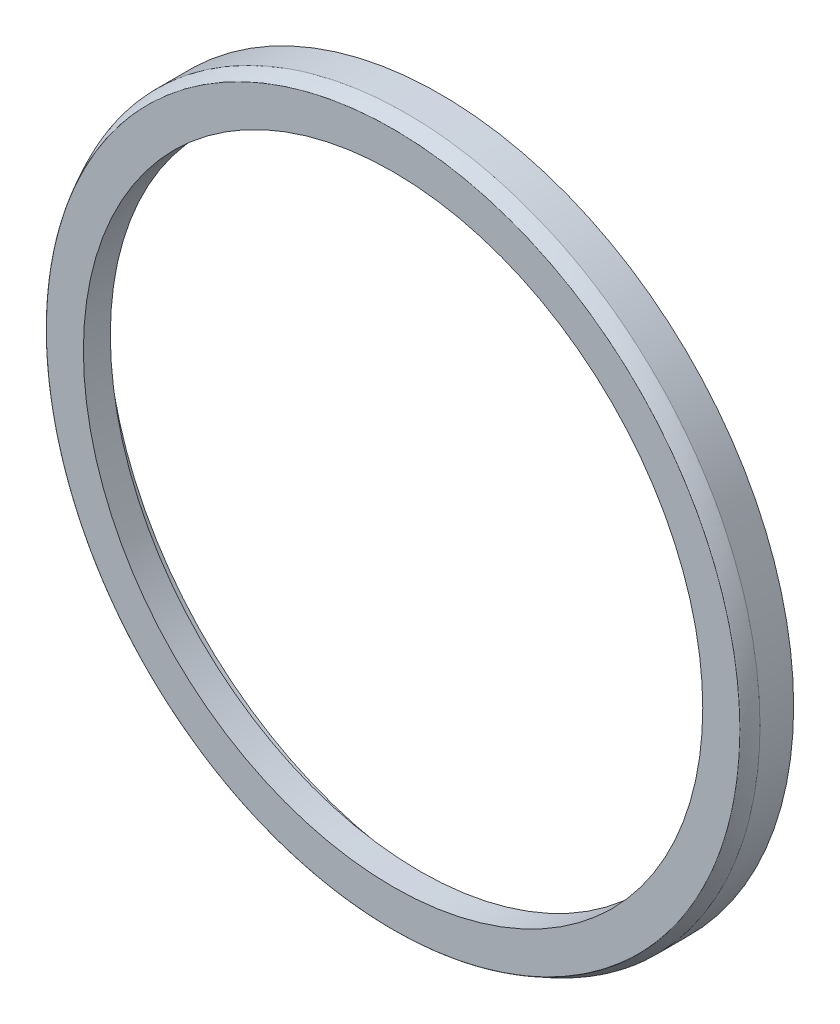
ISO-10303-21;
HEADER;
FILE_DESCRIPTION(('STEP AP214'),'2;1');
FILE_NAME('part.step','',(''),(''),'','','');
FILE_SCHEMA(('AUTOMOTIVE_DESIGN { 1 0 10303 214 1 1 1 1 }'));
ENDSEC;
DATA;
#1=APPLICATION_CONTEXT('core data for automotive mechanical design processes');
#2=APPLICATION_PROTOCOL_DEFINITION('international standard','automotive_design',2000,#1);
#3=PRODUCT_CONTEXT('',#1,'mechanical');
#4=PRODUCT('Part','Part','',(#3));
#5=PRODUCT_RELATED_PRODUCT_CATEGORY('part','',(#4));
#6=PRODUCT_DEFINITION_FORMATION('','',#4);
#7=PRODUCT_DEFINITION_CONTEXT('part definition',#1,'design');
#8=PRODUCT_DEFINITION('design','',#6,#7);
#9=PRODUCT_DEFINITION_SHAPE('','',#8);
#10=(LENGTH_UNIT() NAMED_UNIT(*) SI_UNIT(.MILLI.,.METRE.));
#11=(NAMED_UNIT(*) PLANE_ANGLE_UNIT() SI_UNIT($,.RADIAN.));
#12=(NAMED_UNIT(*) SI_UNIT($,.STERADIAN.) SOLID_ANGLE_UNIT());
#13=UNCERTAINTY_MEASURE_WITH_UNIT(LENGTH_MEASURE(1.E-05),#10,'distance_accuracy_value','');
#14=(GEOMETRIC_REPRESENTATION_CONTEXT(3) GLOBAL_UNCERTAINTY_ASSIGNED_CONTEXT((#13)) GLOBAL_UNIT_ASSIGNED_CONTEXT((#10,
#11,#12)) REPRESENTATION_CONTEXT('',''));
#15=CARTESIAN_POINT('',(0.,0.,0.));
#16=DIRECTION('',(0.,0.,1.));
#17=DIRECTION('',(1.,0.,0.));
#18=AXIS2_PLACEMENT_3D('',#15,#16,#17);
#19=CARTESIAN_POINT('',(0.,0.,4.));
#20=DIRECTION('',(0.,0.,-1.));
#21=DIRECTION('',(-1.,0.,0.));
#22=AXIS2_PLACEMENT_3D('',#19,#20,#21);
#23=CYLINDRICAL_SURFACE('',#22,52.5);
#24=CARTESIAN_POINT('',(52.5,0.,2.));
#25=CARTESIAN_POINT('',(52.5,3.4361169646343,2.));
#26=CARTESIAN_POINT('',(52.1615803862874,6.87214896517834,2.));
#27=CARTESIAN_POINT('',(50.8208740560518,13.6123348465151,2.));
#28=CARTESIAN_POINT('',(49.8186204908821,16.9163220642137,2.));
#29=CARTESIAN_POINT('',(47.188730422803,23.2654383341207,2.));
#30=CARTESIAN_POINT('',(45.5611589486117,26.3104103931131,2.));
#31=CARTESIAN_POINT('',(41.7431503431556,32.0244640739452,2.));
#32=CARTESIAN_POINT('',(39.5528076189387,34.6934044056488,2.));
#33=CARTESIAN_POINT('',(34.6934044056488,39.5528076189387,2.));
#34=CARTESIAN_POINT('',(32.0244640739492,41.7431503431529,2.));
#35=CARTESIAN_POINT('',(26.310410393109,45.5611589486144,2.));
#36=CARTESIAN_POINT('',(23.2654383341166,47.1887304228047,2.));
#37=CARTESIAN_POINT('',(16.9163220642178,49.8186204908804,2.));
#38=CARTESIAN_POINT('',(13.6123348465117,50.8208740560524,2.));
#39=CARTESIAN_POINT('',(6.87214896518182,52.1615803862867,2.));
#40=CARTESIAN_POINT('',(3.43611696464792,52.5,2.));
#41=CARTESIAN_POINT('',(-3.43611696464791,52.5,2.));
#42=CARTESIAN_POINT('',(-6.87214896517669,52.1615803862877,2.));
#43=CARTESIAN_POINT('',(-13.6123348465167,50.8208740560515,2.));
#44=CARTESIAN_POINT('',(-16.9163220642178,49.8186204908804,2.));
#45=CARTESIAN_POINT('',(-23.2654383341166,47.1887304228047,2.));
#46=CARTESIAN_POINT('',(-26.310410393105,45.5611589486171,2.));
#47=CARTESIAN_POINT('',(-32.0244640739532,41.7431503431502,2.));
#48=CARTESIAN_POINT('',(-34.6934044056488,39.5528076189387,2.));
#49=CARTESIAN_POINT('',(-39.5528076189388,34.6934044056487,2.));
#50=CARTESIAN_POINT('',(-41.7431503431492,32.0244640739546,2.));
#51=CARTESIAN_POINT('',(-45.561158948618,26.3104103931037,2.));
#52=CARTESIAN_POINT('',(-47.1887304228046,23.2654383341167,2.));
#53=CARTESIAN_POINT('',(-49.8186204908804,16.9163220642179,2.));
#54=CARTESIAN_POINT('',(-50.8208740560519,13.6123348465145,2.));
#55=CARTESIAN_POINT('',(-52.1615803862873,6.872148965179,2.));
#56=CARTESIAN_POINT('',(-52.5,3.43611696464792,2.));
#57=CARTESIAN_POINT('',(-52.5,-3.43611696464791,2.));
#58=CARTESIAN_POINT('',(-52.1615803862872,-6.8721489651795,2.));
#59=CARTESIAN_POINT('',(-50.820874056052,-13.6123348465139,2.));
#60=CARTESIAN_POINT('',(-49.8186204908825,-16.9163220642127,2.));
#61=CARTESIAN_POINT('',(-47.1887304228026,-23.2654383341215,2.));
#62=CARTESIAN_POINT('',(-45.5611589486207,-26.3104103930996,2.));
#63=CARTESIAN_POINT('',(-41.7431503431466,-32.0244640739586,2.));
#64=CARTESIAN_POINT('',(-39.5528076189387,-34.6934044056488,2.));
#65=CARTESIAN_POINT('',(-34.6934044056487,-39.5528076189388,2.));
#66=CARTESIAN_POINT('',(-32.0244640739579,-41.743150343147,2.));
#67=CARTESIAN_POINT('',(-26.3104103931004,-45.5611589486202,2.));
#68=CARTESIAN_POINT('',(-23.265438334117,-47.1887304228045,2.));
#69=CARTESIAN_POINT('',(-16.9163220642176,-49.8186204908805,2.));
#70=CARTESIAN_POINT('',(-13.6123348465185,-50.8208740560511,2.));
#71=CARTESIAN_POINT('',(-6.87214896517507,-52.1615803862881,2.));
#72=CARTESIAN_POINT('',(-3.43611696464783,-52.5,2.));
#73=CARTESIAN_POINT('',(3.436116964648,-52.5,2.));
#74=CARTESIAN_POINT('',(6.87214896517496,-52.1615803862881,2.));
#75=CARTESIAN_POINT('',(13.6123348465184,-50.8208740560511,2.));
#76=CARTESIAN_POINT('',(16.9163220642133,-49.8186204908823,2.));
#77=CARTESIAN_POINT('',(23.265438334121,-47.1887304228029,2.));
#78=CARTESIAN_POINT('',(26.3104103930963,-45.5611589486229,2.));
#79=CARTESIAN_POINT('',(32.0244640739619,-41.7431503431443,2.));
#80=CARTESIAN_POINT('',(34.6934044056399,-39.5528076189476,2.));
#81=CARTESIAN_POINT('',(39.5528076189474,-34.6934044056401,2.));
#82=CARTESIAN_POINT('',(41.7431503431524,-32.0244640739499,2.));
#83=CARTESIAN_POINT('',(45.5611589486148,-26.3104103931085,2.));
#84=CARTESIAN_POINT('',(47.1887304228007,-23.2654383341261,2.));
#85=CARTESIAN_POINT('',(49.8186204908843,-16.9163220642084,2.));
#86=CARTESIAN_POINT('',(50.8208740560517,-13.6123348465157,2.));
#87=CARTESIAN_POINT('',(52.1615803862875,-6.87214896517789,2.));
#88=CARTESIAN_POINT('',(52.5,-3.4361169646343,2.));
#89=CARTESIAN_POINT('',(52.5,0.,2.));
#90=(BOUNDED_CURVE() B_SPLINE_CURVE(3,(#24,#25,#26,#27,#28,#29,#30,#31,#32,#33,#34,#35,#36,#37,
#38,#39,#40,#41,#42,#43,#44,#45,#46,#47,#48,#49,#50,#51,#52,#53,#54,#55,#56,#57,#58,#59,#60,#61,
#62,#63,#64,#65,#66,#67,#68,#69,#70,#71,#72,#73,#74,#75,#76,#77,#78,#79,#80,#81,#82,#83,#84,#85,
#86,#87,#88,#89),.UNSPECIFIED.,.T.,.F.) B_SPLINE_CURVE_WITH_KNOTS((4,2,2,2,2,2,2,2,2,2,2,2,2,2,
2,2,2,2,2,2,2,2,2,2,2,2,2,2,2,2,2,2,4),(0.,0.196349540849362,0.392699081698724,
0.589048622548086,0.785398163397448,0.98174770424681,1.17809724509617,1.37444678594553,
1.5707963267949,1.76714586764426,1.96349540849362,2.15984494934298,2.35619449019234,
2.55254403104171,2.74889357189107,2.94524311274043,3.14159265358979,3.33794219443916,
3.53429173528852,3.73064127613788,3.92699081698724,4.1233403578366,4.31968989868597,
4.51603943953533,4.71238898038469,4.90873852123405,5.10508806208341,5.30143760293278,
5.49778714378214,5.6941366846315,5.89048622548086,6.08683576633022,6.28318530717959),
.UNSPECIFIED.) CURVE() GEOMETRIC_REPRESENTATION_ITEM() RATIONAL_B_SPLINE_CURVE((1.,1.,1.,1.,1.,
1.,1.,1.,1.,1.,1.,1.,1.,1.,1.,1.,1.,1.,1.,1.,1.,1.,1.,1.,1.,1.,1.,1.,1.,1.,1.,1.,1.,1.,1.,1.,1.,
1.,1.,1.,1.,1.,1.,1.,1.,1.,1.,1.,1.,1.,1.,1.,1.,1.,1.,1.,1.,1.,1.,1.,1.,1.,1.,1.,1.,1.)) REPRESENTATION_ITEM(''));
#91=CARTESIAN_POINT('',(52.5,0.,2.));
#92=VERTEX_POINT('',#91);
#93=EDGE_CURVE('E11',#92,#92,#90,.F.);
#94=ORIENTED_EDGE('',*,*,#93,.T.);
#95=EDGE_LOOP('',(#94));
#96=FACE_BOUND('',#95,.T.);
#97=CARTESIAN_POINT('',(0.,0.,-3.));
#98=DIRECTION('',(0.,0.,-1.));
#99=DIRECTION('',(-1.,0.,0.));
#100=AXIS2_PLACEMENT_3D('',#97,#98,#99);
#101=CIRCLE('',#100,52.5);
#102=CARTESIAN_POINT('',(-52.5,0.,-3.));
#103=VERTEX_POINT('',#102);
#104=EDGE_CURVE('E54',#103,#103,#101,.T.);
#105=ORIENTED_EDGE('',*,*,#104,.F.);
#106=EDGE_LOOP('',(#105));
#107=FACE_BOUND('',#106,.T.);
#108=ADVANCED_FACE('F36',(#96,#107),#23,.T.);
#109=CARTESIAN_POINT('',(0.,0.,4.));
#110=DIRECTION('',(0.,0.,1.));
#111=DIRECTION('',(1.,0.,0.));
#112=AXIS2_PLACEMENT_3D('',#109,#110,#111);
#113=PLANE('',#112);
#114=CARTESIAN_POINT('',(51.5,0.,4.));
#115=CARTESIAN_POINT('',(51.5000000108444,-0.842667580530355,4.));
#116=CARTESIAN_POINT('',(51.4792516281536,-1.68532907422174,4.));
#117=CARTESIAN_POINT('',(51.3964570643939,-3.36862290645829,4.));
#118=CARTESIAN_POINT('',(51.3344108195161,-4.2092552418662,4.));
#119=CARTESIAN_POINT('',(51.1692195213051,-5.88647115959471,4.));
#120=CARTESIAN_POINT('',(51.0660744679718,-6.7230547419153,4.));
#121=CARTESIAN_POINT('',(50.8188834480993,-8.39015868401936,4.));
#122=CARTESIAN_POINT('',(50.6748375447559,-9.22067905316905,4.));
#123=CARTESIAN_POINT('',(50.3460463367769,-10.8736241144916,4.));
#124=CARTESIAN_POINT('',(50.1613010321413,-11.6960488066645,4.));
#125=CARTESIAN_POINT('',(49.7517026451894,-13.330848040329,4.));
#126=CARTESIAN_POINT('',(49.5268495009034,-14.1432225662904,4.));
#127=CARTESIAN_POINT('',(49.0376238106161,-15.7559835342634,4.));
#128=CARTESIAN_POINT('',(48.7732512646147,-16.5563699762751,4.));
#129=CARTESIAN_POINT('',(48.2055740800055,-18.1432165399242,4.));
#130=CARTESIAN_POINT('',(47.9022695015519,-18.9296766830772,4.));
#131=CARTESIAN_POINT('',(47.2573223471105,-20.4867168505273,4.));
#132=CARTESIAN_POINT('',(46.9156797711227,-21.2572968748245,4.));
#133=CARTESIAN_POINT('',(46.1950181915309,-22.7807752278869,4.));
#134=CARTESIAN_POINT('',(45.8159991301777,-23.5336735293306,4.));
#135=CARTESIAN_POINT('',(45.0215397182715,-25.0200025475314,4.));
#136=CARTESIAN_POINT('',(44.6060993677184,-25.7534332642886,4.));
#137=CARTESIAN_POINT('',(43.7397515338071,-27.1990406921076,4.));
#138=CARTESIAN_POINT('',(43.2888441052498,-27.911217436007,4.));
#139=CARTESIAN_POINT('',(42.3525259619122,-29.3125165650122,4.));
#140=CARTESIAN_POINT('',(41.867115247132,-30.0016389501178,4.));
#141=CARTESIAN_POINT('',(40.8630850952229,-31.3552499942351,4.));
#142=CARTESIAN_POINT('',(40.3444656067847,-32.0197386151837,4.));
#143=CARTESIAN_POINT('',(39.2753031029285,-33.3225168955602,4.));
#144=CARTESIAN_POINT('',(38.7247600875105,-33.9608065549882,4.));
#145=CARTESIAN_POINT('',(37.5930348656984,-35.2096209635434,4.));
#146=CARTESIAN_POINT('',(37.0118527066458,-35.8201457555684,4.));
#147=CARTESIAN_POINT('',(35.8201457555687,-37.0118527066459,4.));
#148=CARTESIAN_POINT('',(35.2096209635442,-37.5930348656985,4.));
#149=CARTESIAN_POINT('',(33.9608065549905,-38.7247600875106,4.));
#150=CARTESIAN_POINT('',(33.3225168955636,-39.2753031029287,4.));
#151=CARTESIAN_POINT('',(32.0197386151885,-40.3444656067851,4.));
#152=CARTESIAN_POINT('',(31.3552499942402,-40.8630850952235,4.));
#153=CARTESIAN_POINT('',(30.0016389501212,-41.8671152471325,4.));
#154=CARTESIAN_POINT('',(29.3125165650134,-42.3525259619125,4.));
#155=CARTESIAN_POINT('',(27.9112174360057,-43.2888441052496,4.));
#156=CARTESIAN_POINT('',(27.1990406921058,-43.7397515338068,4.));
#157=CARTESIAN_POINT('',(25.7534332642817,-44.606099367718,4.));
#158=CARTESIAN_POINT('',(25.0200025475199,-45.0215397182712,4.));
#159=CARTESIAN_POINT('',(23.5336735293337,-45.8159991301777,4.));
#160=CARTESIAN_POINT('',(22.7807752279093,-46.1950181915311,4.));
#161=CARTESIAN_POINT('',(21.2572968747983,-46.9156797711227,4.));
#162=CARTESIAN_POINT('',(20.4867168504332,-47.2573223471102,4.));
#163=CARTESIAN_POINT('',(18.9296766831704,-47.9022695015526,4.));
#164=CARTESIAN_POINT('',(18.1432165402725,-48.2055740800075,4.));
#165=CARTESIAN_POINT('',(16.5563699759264,-48.7732512646161,4.));
#166=CARTESIAN_POINT('',(15.7559835329627,-49.0376238106156,4.));
#167=CARTESIAN_POINT('',(14.143222567591,-49.5268495009126,4.));
#168=CARTESIAN_POINT('',(13.3308480451831,-49.7517026452101,4.));
#169=CARTESIAN_POINT('',(11.6960488018106,-50.1613010321305,4.));
#170=CARTESIAN_POINT('',(10.8736240963764,-50.346046336723,4.));
#171=CARTESIAN_POINT('',(9.22067907128455,-50.6748375448097,4.));
#172=CARTESIAN_POINT('',(8.39015875162687,-50.8188834483038,4.));
#173=CARTESIAN_POINT('',(6.72305467431141,-51.0660744677575,4.));
#174=CARTESIAN_POINT('',(5.88647090728705,-51.1692195205214,4.));
#175=CARTESIAN_POINT('',(4.20925549418297,-51.3344108202912,4.));
#176=CARTESIAN_POINT('',(3.36862384810326,-51.3964570672972,4.));
#177=CARTESIAN_POINT('',(1.68532813258754,-51.4792516252471,4.));
#178=CARTESIAN_POINT('',(0.842664066293814,-51.4999999999998,4.));
#179=CARTESIAN_POINT('',(-0.842664066293651,-51.5000000000002,4.));
#180=CARTESIAN_POINT('',(-1.68532813258738,-51.4792516252479,4.));
#181=CARTESIAN_POINT('',(-3.36862384810315,-51.3964570672996,4.));
#182=CARTESIAN_POINT('',(-4.2092554941829,-51.3344108202948,4.));
#183=CARTESIAN_POINT('',(-5.88647090728711,-51.1692195205265,4.));
#184=CARTESIAN_POINT('',(-6.72305467431157,-51.0660744677631,4.));
#185=CARTESIAN_POINT('',(-8.39015875162713,-50.818883448308,4.));
#186=CARTESIAN_POINT('',(-9.2206790712848,-50.6748375448119,4.));
#187=CARTESIAN_POINT('',(-10.8736240963768,-50.3460463367207,4.));
#188=CARTESIAN_POINT('',(-11.6960488018111,-50.1613010321254,4.));
#189=CARTESIAN_POINT('',(-13.3308480451843,-49.7517026452019,4.));
#190=CARTESIAN_POINT('',(-14.1432225675927,-49.5268495009039,4.));
#191=CARTESIAN_POINT('',(-15.7559835329649,-49.037623810607,4.));
#192=CARTESIAN_POINT('',(-16.5563699759287,-48.7732512646081,4.));
#193=CARTESIAN_POINT('',(-18.1432165402741,-48.2055740800027,4.));
#194=CARTESIAN_POINT('',(-18.9296766831713,-47.9022695015504,4.));
#195=CARTESIAN_POINT('',(-20.4867168504327,-47.2573223471122,4.));
#196=CARTESIAN_POINT('',(-21.257296874797,-46.9156797711265,4.));
#197=CARTESIAN_POINT('',(-22.7807752279073,-46.1950181915363,4.));
#198=CARTESIAN_POINT('',(-23.5336735293317,-45.8159991301826,4.));
#199=CARTESIAN_POINT('',(-25.0200025475183,-45.0215397182747,4.));
#200=CARTESIAN_POINT('',(-25.7534332642805,-44.6060993677204,4.));
#201=CARTESIAN_POINT('',(-27.1990406921053,-43.7397515338077,4.));
#202=CARTESIAN_POINT('',(-27.9112174360054,-43.28884410525,4.));
#203=CARTESIAN_POINT('',(-29.3125165650137,-42.352525961912,4.));
#204=CARTESIAN_POINT('',(-30.001638950122,-41.8671152471318,4.));
#205=CARTESIAN_POINT('',(-31.355249994242,-40.8630850952218,4.));
#206=CARTESIAN_POINT('',(-32.0197386151908,-40.3444656067827,4.));
#207=CARTESIAN_POINT('',(-33.3225168955666,-39.2753031029255,4.));
#208=CARTESIAN_POINT('',(-33.9608065549937,-38.7247600875074,4.));
#209=CARTESIAN_POINT('',(-35.2096209635464,-37.5930348656962,4.));
#210=CARTESIAN_POINT('',(-35.8201457555698,-37.0118527066447,4.));
#211=CARTESIAN_POINT('',(-37.0118527066446,-35.8201457555696,4.));
#212=CARTESIAN_POINT('',(-37.5930348656959,-35.209620963546,4.));
#213=CARTESIAN_POINT('',(-38.7247600875066,-33.9608065549925,4.));
#214=CARTESIAN_POINT('',(-39.2753031029243,-33.3225168955649,4.));
#215=CARTESIAN_POINT('',(-40.3444656067809,-32.0197386151884,4.));
#216=CARTESIAN_POINT('',(-40.8630850952197,-31.3552499942394,4.));
#217=CARTESIAN_POINT('',(-41.8671152471303,-30.0016389501201,4.));
#218=CARTESIAN_POINT('',(-42.3525259619113,-29.3125165650128,4.));
#219=CARTESIAN_POINT('',(-43.2888441052506,-27.9112174360065,4.));
#220=CARTESIAN_POINT('',(-43.7397515338088,-27.1990406921075,4.));
#221=CARTESIAN_POINT('',(-44.6060993677213,-25.753433264284,4.));
#222=CARTESIAN_POINT('',(-45.0215397182749,-25.020002547522,4.));
#223=CARTESIAN_POINT('',(-45.8159991301816,-23.5336735293351,4.));
#224=CARTESIAN_POINT('',(-46.1950181915347,-22.7807752279102,4.));
#225=CARTESIAN_POINT('',(-46.915679771125,-21.2572968747986,4.));
#226=CARTESIAN_POINT('',(-47.2573223471114,-20.4867168504334,4.));
#227=CARTESIAN_POINT('',(-47.9022695015513,-18.9296766831704,4.));
#228=CARTESIAN_POINT('',(-48.2055740800048,-18.1432165402725,4.));
#229=CARTESIAN_POINT('',(-48.7732512646115,-16.5563699759262,4.));
#230=CARTESIAN_POINT('',(-49.0376238106104,-15.7559835329623,4.));
#231=CARTESIAN_POINT('',(-49.5268495009071,-14.1432225675902,4.));
#232=CARTESIAN_POINT('',(-49.7517026452047,-13.3308480451821,4.));
#233=CARTESIAN_POINT('',(-50.161301032127,-11.6960488018099,4.));
#234=CARTESIAN_POINT('',(-50.3460463367214,-10.8736240963761,4.));
#235=CARTESIAN_POINT('',(-50.6748375448113,-9.22067907128501,4.));
#236=CARTESIAN_POINT('',(-50.8188834483068,-8.39015875162769,4.));
#237=CARTESIAN_POINT('',(-51.0660744677616,-6.7230546743125,4.));
#238=CARTESIAN_POINT('',(-51.1692195205251,-5.88647090728805,4.));
#239=CARTESIAN_POINT('',(-51.3344108202937,-4.20925549418367,4.));
#240=CARTESIAN_POINT('',(-51.3964570672989,-3.36862384810374,4.));
#241=CARTESIAN_POINT('',(-51.4792516252477,-1.68532813258768,4.));
#242=CARTESIAN_POINT('',(-51.5000000000002,-0.842664066293838,4.));
#243=CARTESIAN_POINT('',(-51.4999999999998,0.842664066293731,4.));
#244=CARTESIAN_POINT('',(-51.4792516252469,1.68532813258745,4.));
#245=CARTESIAN_POINT('',(-51.3964570672965,3.36862384810316,4.));
#246=CARTESIAN_POINT('',(-51.3344108202902,4.20925549418286,4.));
#247=CARTESIAN_POINT('',(-51.1692195205199,5.8864709072869,4.));
#248=CARTESIAN_POINT('',(-51.0660744677559,6.72305467431123,4.));
#249=CARTESIAN_POINT('',(-50.8188834483026,8.39015875162676,4.));
#250=CARTESIAN_POINT('',(-50.6748375448092,9.22067907128454,4.));
#251=CARTESIAN_POINT('',(-50.3460463367235,10.8736240963769,4.));
#252=CARTESIAN_POINT('',(-50.1613010321311,11.6960488018115,4.));
#253=CARTESIAN_POINT('',(-49.7517026452104,13.3308480451849,4.));
#254=CARTESIAN_POINT('',(-49.5268495009122,14.1432225675934,4.));
#255=CARTESIAN_POINT('',(-49.037623810614,15.7559835329656,4.));
#256=CARTESIAN_POINT('',(-48.773251264614,16.5563699759294,4.));
#257=CARTESIAN_POINT('',(-48.2055740800057,18.1432165402745,4.));
#258=CARTESIAN_POINT('',(-47.9022695015515,18.9296766831714,4.));
#259=CARTESIAN_POINT('',(-47.2573223471111,20.4867168504326,4.));
#260=CARTESIAN_POINT('',(-46.9156797711248,21.257296874797,4.));
#261=CARTESIAN_POINT('',(-46.1950181915345,22.7807752279079,4.));
#262=CARTESIAN_POINT('',(-45.8159991301814,23.5336735293329,4.));
#263=CARTESIAN_POINT('',(-45.0215397182748,25.0200025475203,4.));
#264=CARTESIAN_POINT('',(-44.6060993677213,25.7534332642828,4.));
#265=CARTESIAN_POINT('',(-43.7397515338088,27.1990406921071,4.));
#266=CARTESIAN_POINT('',(-43.2888441052506,27.9112174360063,4.));
#267=CARTESIAN_POINT('',(-42.3525259619114,29.3125165650129,4.));
#268=CARTESIAN_POINT('',(-41.8671152471303,30.0016389501202,4.));
#269=CARTESIAN_POINT('',(-40.8630850952197,31.3552499942394,4.));
#270=CARTESIAN_POINT('',(-40.3444656067809,32.0197386151884,4.));
#271=CARTESIAN_POINT('',(-39.2753031029244,33.3225168955649,4.));
#272=CARTESIAN_POINT('',(-38.7247600875066,33.9608065549925,4.));
#273=CARTESIAN_POINT('',(-37.5930348656959,35.209620963546,4.));
#274=CARTESIAN_POINT('',(-37.0118527066446,35.8201457555696,4.));
#275=CARTESIAN_POINT('',(-35.8201457555696,37.011852706645,4.));
#276=CARTESIAN_POINT('',(-35.2096209635459,37.5930348656968,4.));
#277=CARTESIAN_POINT('',(-33.9608065549925,38.7247600875091,4.));
#278=CARTESIAN_POINT('',(-33.322516895565,39.2753031029279,4.));
#279=CARTESIAN_POINT('',(-32.0197386151887,40.3444656067859,4.));
#280=CARTESIAN_POINT('',(-31.3552499942398,40.8630850952251,4.));
#281=CARTESIAN_POINT('',(-30.0016389501205,41.8671152471342,4.));
#282=CARTESIAN_POINT('',(-29.312516565013,42.3525259619133,4.));
#283=CARTESIAN_POINT('',(-27.9112174360063,43.2888441052486,4.));
#284=CARTESIAN_POINT('',(-27.1990406921071,43.7397515338048,4.));
#285=CARTESIAN_POINT('',(-25.7534332642836,44.6060993677159,4.));
#286=CARTESIAN_POINT('',(-25.0200025475217,45.0215397182698,4.));
#287=CARTESIAN_POINT('',(-23.5336735293351,45.815999130178,4.));
#288=CARTESIAN_POINT('',(-22.7807752279104,46.1950181915322,4.));
#289=CARTESIAN_POINT('',(-21.2572968747988,46.9156797711242,4.));
#290=CARTESIAN_POINT('',(-20.4867168504336,47.2573223471111,4.));
#291=CARTESIAN_POINT('',(-18.9296766831705,47.9022695015514,4.));
#292=CARTESIAN_POINT('',(-18.1432165402726,48.2055740800048,4.));
#293=CARTESIAN_POINT('',(-16.5563699759262,48.7732512646114,4.));
#294=CARTESIAN_POINT('',(-15.7559835329623,49.0376238106104,4.));
#295=CARTESIAN_POINT('',(-14.1432225675903,49.5268495009071,4.));
#296=CARTESIAN_POINT('',(-13.3308480451822,49.7517026452047,4.));
#297=CARTESIAN_POINT('',(-11.6960488018099,50.161301032127,4.));
#298=CARTESIAN_POINT('',(-10.8736240963761,50.3460463367214,4.));
#299=CARTESIAN_POINT('',(-9.22067907128502,50.6748375448113,4.));
#300=CARTESIAN_POINT('',(-8.3901587516277,50.8188834483068,4.));
#301=CARTESIAN_POINT('',(-6.72305467431251,51.0660744677616,4.));
#302=CARTESIAN_POINT('',(-5.88647090728806,51.1692195205251,4.));
#303=CARTESIAN_POINT('',(-4.20925549418368,51.3344108202937,4.));
#304=CARTESIAN_POINT('',(-3.36862384810376,51.3964570672989,4.));
#305=CARTESIAN_POINT('',(-1.68532813258769,51.4792516252477,4.));
#306=CARTESIAN_POINT('',(-0.842664066293846,51.5000000000002,4.));
#307=CARTESIAN_POINT('',(0.842664066293869,51.4999999999998,4.));
#308=CARTESIAN_POINT('',(1.68532813258773,51.4792516252469,4.));
#309=CARTESIAN_POINT('',(3.36862384810381,51.3964570672965,4.));
#310=CARTESIAN_POINT('',(4.20925549418373,51.3344108202902,4.));
#311=CARTESIAN_POINT('',(5.88647090728805,51.1692195205199,4.));
#312=CARTESIAN_POINT('',(6.72305467431243,51.0660744677559,4.));
#313=CARTESIAN_POINT('',(8.3901587516276,50.8188834483027,4.));
#314=CARTESIAN_POINT('',(9.22067907128496,50.6748375448092,4.));
#315=CARTESIAN_POINT('',(10.8736240963762,50.3460463367235,4.));
#316=CARTESIAN_POINT('',(11.6960488018101,50.1613010321311,4.));
#317=CARTESIAN_POINT('',(13.3308480451825,49.7517026452103,4.));
#318=CARTESIAN_POINT('',(14.1432225675905,49.5268495009122,4.));
#319=CARTESIAN_POINT('',(15.7559835329624,49.037623810614,4.));
#320=CARTESIAN_POINT('',(16.5563699759262,48.7732512646139,4.));
#321=CARTESIAN_POINT('',(18.1432165402725,48.2055740800057,4.));
#322=CARTESIAN_POINT('',(18.9296766831704,47.9022695015517,4.));
#323=CARTESIAN_POINT('',(20.4867168504338,47.2573223471109,4.));
#324=CARTESIAN_POINT('',(21.2572968747993,46.9156797711241,4.));
#325=CARTESIAN_POINT('',(22.7807752279116,46.1950181915322,4.));
#326=CARTESIAN_POINT('',(23.5336735293368,45.815999130178,4.));
#327=CARTESIAN_POINT('',(25.0200025475241,45.0215397182699,4.));
#328=CARTESIAN_POINT('',(25.7534332642861,44.6060993677161,4.));
#329=CARTESIAN_POINT('',(27.1990406921089,43.739751533805,4.));
#330=CARTESIAN_POINT('',(27.9112174360072,43.2888441052487,4.));
#331=CARTESIAN_POINT('',(29.3125165650121,42.3525259619132,4.));
#332=CARTESIAN_POINT('',(30.0016389501187,41.8671152471339,4.));
#333=CARTESIAN_POINT('',(31.3552499942373,40.8630850952249,4.));
#334=CARTESIAN_POINT('',(32.0197386151863,40.3444656067857,4.));
#335=CARTESIAN_POINT('',(33.3225168955632,39.2753031029278,4.));
#336=CARTESIAN_POINT('',(33.9608065549912,38.7247600875091,4.));
#337=CARTESIAN_POINT('',(35.2096209635454,37.5930348656969,4.));
#338=CARTESIAN_POINT('',(35.8201457555693,37.0118527066451,4.));
#339=CARTESIAN_POINT('',(37.0118527066451,35.8201457555693,4.));
#340=CARTESIAN_POINT('',(37.5930348656969,35.2096209635454,4.));
#341=CARTESIAN_POINT('',(38.7247600875091,33.9608065549912,4.));
#342=CARTESIAN_POINT('',(39.2753031029278,33.3225168955633,4.));
#343=CARTESIAN_POINT('',(40.3444656067857,32.0197386151862,4.));
#344=CARTESIAN_POINT('',(40.8630850952249,31.3552499942372,4.));
#345=CARTESIAN_POINT('',(41.8671152471339,30.0016389501189,4.));
#346=CARTESIAN_POINT('',(42.3525259619132,29.3125165650126,4.));
#347=CARTESIAN_POINT('',(43.2888441052486,27.9112174360069,4.));
#348=CARTESIAN_POINT('',(43.7397515338047,27.1990406921074,4.));
#349=CARTESIAN_POINT('',(44.6060993677153,25.7534332642886,4.));
#350=CARTESIAN_POINT('',(45.0215397182689,25.0200025475317,4.));
#351=CARTESIAN_POINT('',(45.8159991301765,23.5336735293313,4.));
#352=CARTESIAN_POINT('',(46.1950181915304,22.7807752278878,4.));
#353=CARTESIAN_POINT('',(46.915679771123,21.2572968748251,4.));
#354=CARTESIAN_POINT('',(47.2573223471108,20.4867168505276,4.));
#355=CARTESIAN_POINT('',(47.9022695015517,18.9296766830768,4.));
#356=CARTESIAN_POINT('',(48.2055740800048,18.1432165399234,4.));
#357=CARTESIAN_POINT('',(48.7732512646138,16.5563699762737,4.));
#358=CARTESIAN_POINT('',(49.0376238106154,15.755983534262,4.));
#359=CARTESIAN_POINT('',(49.5268495009033,14.143222566289,4.));
#360=CARTESIAN_POINT('',(49.7517026451896,13.3308480403278,4.));
#361=CARTESIAN_POINT('',(50.1613010321416,11.6960488066637,4.));
#362=CARTESIAN_POINT('',(50.3460463367771,10.8736241144912,4.));
#363=CARTESIAN_POINT('',(50.6748375447557,9.22067905316924,4.));
#364=CARTESIAN_POINT('',(50.8188834480989,8.3901586840198,4.));
#365=CARTESIAN_POINT('',(51.0660744679711,6.72305474191598,4.));
#366=CARTESIAN_POINT('',(51.1692195213045,5.88647115959539,4.));
#367=CARTESIAN_POINT('',(51.3344108195157,4.20925524186674,4.));
#368=CARTESIAN_POINT('',(51.3964570643936,3.36862290645869,4.));
#369=CARTESIAN_POINT('',(51.4792516281535,1.68532907422192,4.));
#370=CARTESIAN_POINT('',(51.5000000108444,0.842667580530444,4.));
#371=CARTESIAN_POINT('',(51.5,0.,4.));
#372=B_SPLINE_CURVE_WITH_KNOTS('',3,(#114,#115,#116,#117,#118,#119,#120,#121,#122,#123,#124,
#125,#126,#127,#128,#129,#130,#131,#132,#133,#134,#135,#136,#137,#138,#139,#140,#141,#142,#143,
#144,#145,#146,#147,#148,#149,#150,#151,#152,#153,#154,#155,#156,#157,#158,#159,#160,#161,#162,
#163,#164,#165,#166,#167,#168,#169,#170,#171,#172,#173,#174,#175,#176,#177,#178,#179,#180,#181,
#182,#183,#184,#185,#186,#187,#188,#189,#190,#191,#192,#193,#194,#195,#196,#197,#198,#199,#200,
#201,#202,#203,#204,#205,#206,#207,#208,#209,#210,#211,#212,#213,#214,#215,#216,#217,#218,#219,
#220,#221,#222,#223,#224,#225,#226,#227,#228,#229,#230,#231,#232,#233,#234,#235,#236,#237,#238,
#239,#240,#241,#242,#243,#244,#245,#246,#247,#248,#249,#250,#251,#252,#253,#254,#255,#256,#257,
#258,#259,#260,#261,#262,#263,#264,#265,#266,#267,#268,#269,#270,#271,#272,#273,#274,#275,#276,
#277,#278,#279,#280,#281,#282,#283,#284,#285,#286,#287,#288,#289,#290,#291,#292,#293,#294,#295,
#296,#297,#298,#299,#300,#301,#302,#303,#304,#305,#306,#307,#308,#309,#310,#311,#312,#313,#314,
#315,#316,#317,#318,#319,#320,#321,#322,#323,#324,#325,#326,#327,#328,#329,#330,#331,#332,#333,
#334,#335,#336,#337,#338,#339,#340,#341,#342,#343,#344,#345,#346,#347,#348,#349,#350,#351,#352,
#353,#354,#355,#356,#357,#358,#359,#360,#361,#362,#363,#364,#365,#366,#367,#368,#369,#370,#371),
.UNSPECIFIED.,.F.,.F.,(4,2,2,2,2,2,2,2,2,2,2,2,2,2,2,2,2,2,2,2,2,2,2,2,2,2,2,2,2,2,2,2,2,2,2,2,
2,2,2,2,2,2,2,2,2,2,2,2,2,2,2,2,2,2,2,2,2,2,2,2,2,2,2,2,2,2,2,2,2,2,2,2,2,2,2,2,2,2,2,2,2,2,2,2,
2,2,2,2,2,2,2,2,2,2,2,2,2,2,2,2,2,2,2,2,2,2,2,2,2,2,2,2,2,2,2,2,2,2,2,2,2,2,2,2,2,2,2,2,4),(0.,
2.52773939477991,5.0554826951529,7.58322599552878,10.1109653903174,12.6387047851039,
15.1664480854759,17.6941913858478,20.2219307806347,22.7496701754221,25.2774134757947,
27.8051567761665,30.3328961709519,32.8606355657376,35.3883788661098,37.9161221664822,
40.4438615612689,42.9716009560544,45.4993442564246,48.0270875567963,50.5548269515861,
53.0825663463756,55.6103096467469,58.1380529471171,60.6657923419031,63.1935317366905,
65.7212750370633,68.2490183374354,70.7767577322208,73.3044971270067,75.8322404273795,
78.359983727752,80.8877231225376,83.4154625173231,85.9432058176955,88.4709491180683,
90.9986885128551,93.5264279076428,96.0541712080168,98.5819145083891,101.109653903172,
103.637393297954,106.165136598324,108.692879898698,111.220619293489,113.74835868828,
116.276101988655,118.803845289025,121.331584683806,123.859324078587,126.387067378959,
128.914810679333,131.442550074123,133.970289468912,136.498032769285,139.025776069656,
141.553515464441,144.081254859227,146.6089981596,149.136741459972,151.664480854758,
154.192220249543,156.719963549916,159.247706850289,161.775446245075,164.303185639861,
166.830928940233,169.358672240606,171.886411635392,174.414151030178,176.941894330553,
179.469637630926,181.99737702571,184.525116420493,187.052859720864,189.580603021237,
192.108342416027,194.636081810817,197.163825111192,199.691568411563,202.219307806344,
204.747047201126,207.274790501499,209.802533801874,212.330273196661,214.858012591448,
217.38575589182,219.913499192193,222.441238586978,224.968977981764,227.496721282137,
230.02446458251,232.552203977295,235.079943372081,237.607686672454,240.135429972827,
242.663169367613,245.190908762399,247.718652062772,250.246395363145,252.774134757929,
255.301874152714,257.829617453087,260.357360753461,262.885100148247,265.412839543033,
267.940582843407,270.46832614378,272.996065538564,275.52380493335,278.051548233725,
280.579291534099,283.107030928881,285.634770323664,288.162513624038,290.690256924413,
293.217996319199,295.745735713982,298.273479014354,300.801222314727,303.328961709516,
305.856701104303,308.384444404676,310.912187705047,313.439927099833,315.967666494621,
318.495409794996,321.02315309537,323.55089249015),.UNSPECIFIED.);
#373=CARTESIAN_POINT('',(51.5,0.,4.));
#374=VERTEX_POINT('',#373);
#375=EDGE_CURVE('E49',#374,#374,#372,.F.);
#376=ORIENTED_EDGE('',*,*,#375,.T.);
#377=EDGE_LOOP('',(#376));
#378=FACE_BOUND('',#377,.T.);
#379=CARTESIAN_POINT('',(0.,0.,4.));
#380=DIRECTION('',(0.,0.,1.));
#381=DIRECTION('',(1.,0.,0.));
#382=AXIS2_PLACEMENT_3D('',#379,#380,#381);
#383=CIRCLE('',#382,46.);
#384=CARTESIAN_POINT('',(46.,0.,4.));
#385=VERTEX_POINT('',#384);
#386=EDGE_CURVE('E129',#385,#385,#383,.T.);
#387=ORIENTED_EDGE('',*,*,#386,.F.);
#388=EDGE_LOOP('',(#387));
#389=FACE_BOUND('',#388,.T.);
#390=ADVANCED_FACE('F72',(#378,#389),#113,.T.);
#391=CARTESIAN_POINT('',(0.,0.,-3.));
#392=DIRECTION('',(0.,0.,-1.));
#393=DIRECTION('',(-1.,0.,0.));
#394=AXIS2_PLACEMENT_3D('',#391,#392,#393);
#395=PLANE('',#394);
#396=ORIENTED_EDGE('',*,*,#104,.T.);
#397=EDGE_LOOP('',(#396));
#398=FACE_BOUND('',#397,.T.);
#399=CARTESIAN_POINT('',(0.,0.,-3.));
#400=DIRECTION('',(0.,0.,-1.));
#401=DIRECTION('',(-1.,0.,0.));
#402=AXIS2_PLACEMENT_3D('',#399,#400,#401);
#403=CIRCLE('',#402,49.5);
#404=CARTESIAN_POINT('',(-49.5,0.,-3.));
#405=VERTEX_POINT('',#404);
#406=EDGE_CURVE('E59',#405,#405,#403,.T.);
#407=ORIENTED_EDGE('',*,*,#406,.F.);
#408=EDGE_LOOP('',(#407));
#409=FACE_BOUND('',#408,.T.);
#410=ADVANCED_FACE('F82',(#398,#409),#395,.T.);
#411=CARTESIAN_POINT('',(0.,0.,-3.));
#412=DIRECTION('',(0.,0.,1.));
#413=DIRECTION('',(1.,0.,0.));
#414=AXIS2_PLACEMENT_3D('',#411,#412,#413);
#415=CYLINDRICAL_SURFACE('',#414,49.5);
#416=ORIENTED_EDGE('',*,*,#406,.T.);
#417=EDGE_LOOP('',(#416));
#418=FACE_BOUND('',#417,.T.);
#419=CARTESIAN_POINT('',(0.,0.,0.));
#420=DIRECTION('',(0.,0.,-1.));
#421=DIRECTION('',(-1.,0.,0.));
#422=AXIS2_PLACEMENT_3D('',#419,#420,#421);
#423=CIRCLE('',#422,49.5);
#424=CARTESIAN_POINT('',(-49.5,0.,0.));
#425=VERTEX_POINT('',#424);
#426=EDGE_CURVE('E64',#425,#425,#423,.T.);
#427=ORIENTED_EDGE('',*,*,#426,.F.);
#428=EDGE_LOOP('',(#427));
#429=FACE_BOUND('',#428,.T.);
#430=ADVANCED_FACE('F87',(#418,#429),#415,.F.);
#431=CARTESIAN_POINT('',(0.,0.,0.));
#432=DIRECTION('',(0.,0.,1.));
#433=DIRECTION('',(1.,0.,0.));
#434=AXIS2_PLACEMENT_3D('',#431,#432,#433);
#435=PLANE('',#434);
#436=CARTESIAN_POINT('',(0.,0.,0.));
#437=DIRECTION('',(0.,0.,-1.));
#438=DIRECTION('',(-1.,0.,0.));
#439=AXIS2_PLACEMENT_3D('',#436,#437,#438);
#440=CIRCLE('',#439,46.);
#441=CARTESIAN_POINT('',(-46.,0.,0.));
#442=VERTEX_POINT('',#441);
#443=EDGE_CURVE('E130',#442,#442,#440,.T.);
#444=ORIENTED_EDGE('',*,*,#443,.F.);
#445=EDGE_LOOP('',(#444));
#446=FACE_BOUND('',#445,.T.);
#447=ORIENTED_EDGE('',*,*,#426,.T.);
#448=EDGE_LOOP('',(#447));
#449=FACE_BOUND('',#448,.T.);
#450=ADVANCED_FACE('F84',(#446,#449),#435,.F.);
#451=CARTESIAN_POINT('',(0.,0.,10.));
#452=DIRECTION('',(0.,0.,-1.));
#453=DIRECTION('',(-1.,0.,0.));
#454=AXIS2_PLACEMENT_3D('',#451,#452,#453);
#455=CYLINDRICAL_SURFACE('',#454,46.);
#456=ORIENTED_EDGE('',*,*,#386,.T.);
#457=EDGE_LOOP('',(#456));
#458=FACE_BOUND('',#457,.T.);
#459=ORIENTED_EDGE('',*,*,#443,.T.);
#460=EDGE_LOOP('',(#459));
#461=FACE_BOUND('',#460,.T.);
#462=ADVANCED_FACE('F86',(#458,#461),#455,.F.);
#463=CARTESIAN_POINT('',(51.5,0.,4.));
#464=CARTESIAN_POINT('',(51.5,3.37066711768888,4.));
#465=CARTESIAN_POINT('',(51.1680264741715,6.74125088964933,4.));
#466=CARTESIAN_POINT('',(49.8528574073612,13.3530522780119,4.));
#467=CARTESIAN_POINT('',(48.8696943862981,16.594106405845,4.));
#468=CARTESIAN_POINT('',(46.2898974623645,22.8222871277593,4.));
#469=CARTESIAN_POINT('',(44.6933273495915,25.8092597189548,4.));
#470=CARTESIAN_POINT('',(40.9480427175706,31.4144742820642,4.));
#471=CARTESIAN_POINT('',(38.7994208071512,34.0325776550632,4.));
#472=CARTESIAN_POINT('',(34.0325776550632,38.7994208071512,4.));
#473=CARTESIAN_POINT('',(31.4144742820642,40.9480427175706,4.));
#474=CARTESIAN_POINT('',(25.8092597189548,44.6933273495916,4.));
#475=CARTESIAN_POINT('',(22.8222871277562,46.2898974623682,4.));
#476=CARTESIAN_POINT('',(16.594106405848,48.8696943862944,4.));
#477=CARTESIAN_POINT('',(13.3530522780112,49.8528574073748,4.));
#478=CARTESIAN_POINT('',(6.74125088965004,51.1680264741579,4.));
#479=CARTESIAN_POINT('',(3.37066711770224,51.5,4.));
#480=CARTESIAN_POINT('',(-3.37066711770223,51.5,4.));
#481=CARTESIAN_POINT('',(-6.74125088964997,51.1680264741697,4.));
#482=CARTESIAN_POINT('',(-13.3530522780112,49.8528574073631,4.));
#483=CARTESIAN_POINT('',(-16.594106405848,48.8696943862943,4.));
#484=CARTESIAN_POINT('',(-22.8222871277562,46.2898974623682,4.));
#485=CARTESIAN_POINT('',(-25.8092597189489,44.6933273495916,4.));
#486=CARTESIAN_POINT('',(-31.41447428207,40.9480427175706,4.));
#487=CARTESIAN_POINT('',(-34.0325776550632,38.7994208071512,4.));
#488=CARTESIAN_POINT('',(-38.7994208071512,34.0325776550632,4.));
#489=CARTESIAN_POINT('',(-40.9480427175589,31.4144742820701,4.));
#490=CARTESIAN_POINT('',(-44.6933273496032,25.809259718949,4.));
#491=CARTESIAN_POINT('',(-46.2898974623681,22.8222871277504,4.));
#492=CARTESIAN_POINT('',(-48.8696943862943,16.5941064058539,4.));
#493=CARTESIAN_POINT('',(-49.8528574073748,13.3530522780142,4.));
#494=CARTESIAN_POINT('',(-51.1680264741579,6.74125088964712,4.));
#495=CARTESIAN_POINT('',(-51.5,3.37066711770225,4.));
#496=CARTESIAN_POINT('',(-51.5,-3.37066711770223,4.));
#497=CARTESIAN_POINT('',(-51.1680264741697,-6.74125088964996,4.));
#498=CARTESIAN_POINT('',(-49.8528574073631,-13.3530522780112,4.));
#499=CARTESIAN_POINT('',(-48.8696943862944,-16.5941064058479,4.));
#500=CARTESIAN_POINT('',(-46.2898974623682,-22.8222871277561,4.));
#501=CARTESIAN_POINT('',(-44.6933273496033,-25.8092597189489,4.));
#502=CARTESIAN_POINT('',(-40.9480427175589,-31.41447428207,4.));
#503=CARTESIAN_POINT('',(-38.7994208071512,-34.0325776550632,4.));
#504=CARTESIAN_POINT('',(-34.0325776550632,-38.7994208071512,4.));
#505=CARTESIAN_POINT('',(-31.4144742820757,-40.9480427175628,4.));
#506=CARTESIAN_POINT('',(-25.8092597189434,-44.6933273495993,4.));
#507=CARTESIAN_POINT('',(-22.8222871277515,-46.2898974623737,4.));
#508=CARTESIAN_POINT('',(-16.5941064058529,-48.8696943862887,4.));
#509=CARTESIAN_POINT('',(-13.3530522780138,-49.8528574073597,4.));
#510=CARTESIAN_POINT('',(-6.74125088964755,-51.168026474173,4.));
#511=CARTESIAN_POINT('',(-3.37066711770216,-51.5,4.));
#512=CARTESIAN_POINT('',(3.37066711770232,-51.5,4.));
#513=CARTESIAN_POINT('',(6.74125088964744,-51.1680264741613,4.));
#514=CARTESIAN_POINT('',(13.3530522780137,-49.8528574073714,4.));
#515=CARTESIAN_POINT('',(16.5941064058469,-48.8696943863005,4.));
#516=CARTESIAN_POINT('',(22.8222871277572,-46.2898974623621,4.));
#517=CARTESIAN_POINT('',(25.8092597189433,-44.6933273495993,4.));
#518=CARTESIAN_POINT('',(31.4144742820757,-40.9480427175629,4.));
#519=CARTESIAN_POINT('',(34.0325776550553,-38.799420807159,4.));
#520=CARTESIAN_POINT('',(38.7994208071588,-34.0325776550556,4.));
#521=CARTESIAN_POINT('',(40.9480427175628,-31.414474282064,4.));
#522=CARTESIAN_POINT('',(44.6933273495993,-25.8092597189551,4.));
#523=CARTESIAN_POINT('',(46.289897462362,-22.8222871277573,4.));
#524=CARTESIAN_POINT('',(48.8696943863004,-16.594106405847,4.));
#525=CARTESIAN_POINT('',(49.8528574073597,-13.3530522780138,4.));
#526=CARTESIAN_POINT('',(51.168026474173,-6.74125088964755,4.));
#527=CARTESIAN_POINT('',(51.5,-3.37066711768889,4.));
#528=CARTESIAN_POINT('',(51.5,0.,4.));
#529=CARTESIAN_POINT('',(52.5,0.,4.));
#530=CARTESIAN_POINT('',(52.5,3.4361169646343,4.));
#531=CARTESIAN_POINT('',(52.1615803862834,6.87214896517755,4.));
#532=CARTESIAN_POINT('',(50.8208740560558,13.6123348465159,4.));
#533=CARTESIAN_POINT('',(49.8186204908824,16.9163220642138,4.));
#534=CARTESIAN_POINT('',(47.1887304228027,23.2654383341206,4.));
#535=CARTESIAN_POINT('',(45.5611589486081,26.3104103931107,4.));
#536=CARTESIAN_POINT('',(41.7431503431591,32.0244640739476,4.));
#537=CARTESIAN_POINT('',(39.5528076189387,34.6934044056488,4.));
#538=CARTESIAN_POINT('',(34.6934044056488,39.5528076189387,4.));
#539=CARTESIAN_POINT('',(32.0244640739534,41.7431503431591,4.));
#540=CARTESIAN_POINT('',(26.3104103931048,45.5611589486081,4.));
#541=CARTESIAN_POINT('',(23.2654383341232,47.1887304228065,4.00000000000585));
#542=CARTESIAN_POINT('',(16.9163220642112,49.8186204908786,3.99999999999415));
#543=CARTESIAN_POINT('',(13.6123348465151,50.8208740560694,4.));
#544=CARTESIAN_POINT('',(6.87214896517845,52.1615803862698,4.));
#545=CARTESIAN_POINT('',(3.43611696464792,52.5,4.));
#546=CARTESIAN_POINT('',(-3.43611696464791,52.5,4.));
#547=CARTESIAN_POINT('',(-6.87214896517545,52.1615803862815,4.));
#548=CARTESIAN_POINT('',(-13.6123348465179,50.8208740560577,4.));
#549=CARTESIAN_POINT('',(-16.9163220642171,49.8186204908786,4.));
#550=CARTESIAN_POINT('',(-23.2654383341174,47.1887304228065,4.));
#551=CARTESIAN_POINT('',(-26.310410393099,45.5611589486081,4.));
#552=CARTESIAN_POINT('',(-32.0244640739592,41.7431503431592,4.));
#553=CARTESIAN_POINT('',(-34.6934044056488,39.5528076189387,4.));
#554=CARTESIAN_POINT('',(-39.5528076189388,34.6934044056487,4.));
#555=CARTESIAN_POINT('',(-41.7431503431474,32.0244640739534,4.));
#556=CARTESIAN_POINT('',(-45.5611589486198,26.3104103931049,4.));
#557=CARTESIAN_POINT('',(-47.1887304228065,23.2654383341174,4.));
#558=CARTESIAN_POINT('',(-49.8186204908786,16.9163220642171,4.));
#559=CARTESIAN_POINT('',(-50.8208740560694,13.612334846518,4.));
#560=CARTESIAN_POINT('',(-52.1615803862698,6.87214896517552,4.));
#561=CARTESIAN_POINT('',(-52.5,3.43611696464792,4.));
#562=CARTESIAN_POINT('',(-52.5,-3.43611696464791,4.));
#563=CARTESIAN_POINT('',(-52.1615803862815,-6.87214896517837,4.));
#564=CARTESIAN_POINT('',(-50.8208740560577,-13.612334846515,4.));
#565=CARTESIAN_POINT('',(-49.8186204908787,-16.9163220642111,4.));
#566=CARTESIAN_POINT('',(-47.1887304228065,-23.2654383341231,4.));
#567=CARTESIAN_POINT('',(-45.5611589486198,-26.3104103930931,3.99999999999415));
#568=CARTESIAN_POINT('',(-41.7431503431475,-32.0244640739651,4.00000000000585));
#569=CARTESIAN_POINT('',(-39.5528076189387,-34.6934044056488,4.));
#570=CARTESIAN_POINT('',(-34.6934044056487,-39.5528076189388,4.));
#571=CARTESIAN_POINT('',(-32.0244640739545,-41.7431503431505,3.99999999999415));
#572=CARTESIAN_POINT('',(-26.3104103931039,-45.5611589486166,4.00000000000585));
#573=CARTESIAN_POINT('',(-23.2654383341199,-47.1887304228115,4.));
#574=CARTESIAN_POINT('',(-16.9163220642147,-49.8186204908736,4.));
#575=CARTESIAN_POINT('',(-13.6123348465191,-50.820874056054,4.));
#576=CARTESIAN_POINT('',(-6.87214896517449,-52.1615803862851,4.));
#577=CARTESIAN_POINT('',(-3.43611696464783,-52.5,4.));
#578=CARTESIAN_POINT('',(3.436116964648,-52.5,4.));
#579=CARTESIAN_POINT('',(6.8721489651773,-52.1615803862852,4.00000000000585));
#580=CARTESIAN_POINT('',(13.6123348465161,-50.8208740560541,3.99999999999415));
#581=CARTESIAN_POINT('',(16.9163220642204,-49.8186204908853,4.00000000000585));
#582=CARTESIAN_POINT('',(23.2654383341139,-47.1887304227998,3.99999999999415));
#583=CARTESIAN_POINT('',(26.3104103930863,-45.5611589486167,3.99999999999415));
#584=CARTESIAN_POINT('',(32.0244640739719,-41.7431503431506,4.00000000000585));
#585=CARTESIAN_POINT('',(34.6934044056399,-39.5528076189476,4.));
#586=CARTESIAN_POINT('',(39.5528076189474,-34.6934044056401,4.));
#587=CARTESIAN_POINT('',(41.7431503431505,-32.0244640739486,3.99999999999415));
#588=CARTESIAN_POINT('',(45.5611589486166,-26.3104103931097,4.00000000000585));
#589=CARTESIAN_POINT('',(47.1887304227998,-23.2654383341316,4.00000000000585));
#590=CARTESIAN_POINT('',(49.8186204908853,-16.916322064203,3.99999999999415));
#591=CARTESIAN_POINT('',(50.820874056054,-13.6123348465162,4.));
#592=CARTESIAN_POINT('',(52.1615803862851,-6.87214896517741,4.));
#593=CARTESIAN_POINT('',(52.5,-3.4361169646343,4.));
#594=CARTESIAN_POINT('',(52.5,0.,4.));
#595=CARTESIAN_POINT('',(52.5,0.,2.));
#596=CARTESIAN_POINT('',(52.5,3.4361169646343,2.));
#597=CARTESIAN_POINT('',(52.1615803862874,6.87214896517834,2.));
#598=CARTESIAN_POINT('',(50.8208740560518,13.6123348465151,2.));
#599=CARTESIAN_POINT('',(49.8186204908821,16.9163220642137,2.));
#600=CARTESIAN_POINT('',(47.188730422803,23.2654383341207,2.));
#601=CARTESIAN_POINT('',(45.5611589486117,26.3104103931131,2.));
#602=CARTESIAN_POINT('',(41.7431503431556,32.0244640739452,2.));
#603=CARTESIAN_POINT('',(39.5528076189387,34.6934044056488,2.));
#604=CARTESIAN_POINT('',(34.6934044056488,39.5528076189387,2.));
#605=CARTESIAN_POINT('',(32.0244640739492,41.7431503431529,2.));
#606=CARTESIAN_POINT('',(26.310410393109,45.5611589486144,2.));
#607=CARTESIAN_POINT('',(23.2654383341166,47.1887304228047,2.));
#608=CARTESIAN_POINT('',(16.9163220642178,49.8186204908804,2.));
#609=CARTESIAN_POINT('',(13.6123348465117,50.8208740560524,2.));
#610=CARTESIAN_POINT('',(6.87214896518182,52.1615803862867,2.));
#611=CARTESIAN_POINT('',(3.43611696464792,52.5,2.));
#612=CARTESIAN_POINT('',(-3.43611696464791,52.5,2.));
#613=CARTESIAN_POINT('',(-6.87214896517669,52.1615803862877,2.));
#614=CARTESIAN_POINT('',(-13.6123348465167,50.8208740560515,2.));
#615=CARTESIAN_POINT('',(-16.9163220642178,49.8186204908804,2.));
#616=CARTESIAN_POINT('',(-23.2654383341166,47.1887304228047,2.));
#617=CARTESIAN_POINT('',(-26.310410393105,45.5611589486171,2.));
#618=CARTESIAN_POINT('',(-32.0244640739532,41.7431503431502,2.));
#619=CARTESIAN_POINT('',(-34.6934044056488,39.5528076189387,2.));
#620=CARTESIAN_POINT('',(-39.5528076189388,34.6934044056487,2.));
#621=CARTESIAN_POINT('',(-41.7431503431492,32.0244640739546,2.));
#622=CARTESIAN_POINT('',(-45.561158948618,26.3104103931037,2.));
#623=CARTESIAN_POINT('',(-47.1887304228046,23.2654383341167,2.));
#624=CARTESIAN_POINT('',(-49.8186204908804,16.9163220642179,2.));
#625=CARTESIAN_POINT('',(-50.8208740560519,13.6123348465145,2.));
#626=CARTESIAN_POINT('',(-52.1615803862873,6.872148965179,2.));
#627=CARTESIAN_POINT('',(-52.5,3.43611696464792,2.));
#628=CARTESIAN_POINT('',(-52.5,-3.43611696464791,2.));
#629=CARTESIAN_POINT('',(-52.1615803862872,-6.8721489651795,2.));
#630=CARTESIAN_POINT('',(-50.820874056052,-13.6123348465139,2.));
#631=CARTESIAN_POINT('',(-49.8186204908825,-16.9163220642127,2.));
#632=CARTESIAN_POINT('',(-47.1887304228026,-23.2654383341215,2.));
#633=CARTESIAN_POINT('',(-45.5611589486207,-26.3104103930996,2.));
#634=CARTESIAN_POINT('',(-41.7431503431466,-32.0244640739586,2.));
#635=CARTESIAN_POINT('',(-39.5528076189387,-34.6934044056488,2.));
#636=CARTESIAN_POINT('',(-34.6934044056487,-39.5528076189388,2.));
#637=CARTESIAN_POINT('',(-32.0244640739579,-41.743150343147,2.));
#638=CARTESIAN_POINT('',(-26.3104103931004,-45.5611589486202,2.));
#639=CARTESIAN_POINT('',(-23.265438334117,-47.1887304228045,2.));
#640=CARTESIAN_POINT('',(-16.9163220642176,-49.8186204908805,2.));
#641=CARTESIAN_POINT('',(-13.6123348465185,-50.8208740560511,2.));
#642=CARTESIAN_POINT('',(-6.87214896517507,-52.1615803862881,2.));
#643=CARTESIAN_POINT('',(-3.43611696464783,-52.5,2.));
#644=CARTESIAN_POINT('',(3.436116964648,-52.5,2.));
#645=CARTESIAN_POINT('',(6.87214896517496,-52.1615803862881,2.));
#646=CARTESIAN_POINT('',(13.6123348465184,-50.8208740560511,2.));
#647=CARTESIAN_POINT('',(16.9163220642133,-49.8186204908823,2.));
#648=CARTESIAN_POINT('',(23.265438334121,-47.1887304228029,2.));
#649=CARTESIAN_POINT('',(26.3104103930963,-45.5611589486229,2.));
#650=CARTESIAN_POINT('',(32.0244640739619,-41.7431503431443,2.));
#651=CARTESIAN_POINT('',(34.6934044056399,-39.5528076189476,2.));
#652=CARTESIAN_POINT('',(39.5528076189474,-34.6934044056401,2.));
#653=CARTESIAN_POINT('',(41.7431503431524,-32.0244640739499,2.));
#654=CARTESIAN_POINT('',(45.5611589486148,-26.3104103931085,2.));
#655=CARTESIAN_POINT('',(47.1887304228007,-23.2654383341261,2.));
#656=CARTESIAN_POINT('',(49.8186204908843,-16.9163220642084,2.));
#657=CARTESIAN_POINT('',(50.8208740560517,-13.6123348465157,2.));
#658=CARTESIAN_POINT('',(52.1615803862875,-6.87214896517789,2.));
#659=CARTESIAN_POINT('',(52.5,-3.4361169646343,2.));
#660=CARTESIAN_POINT('',(52.5,0.,2.));
#661=(BOUNDED_SURFACE() B_SPLINE_SURFACE(2,3,((#463,#464,#465,#466,#467,#468,#469,#470,#471,
#472,#473,#474,#475,#476,#477,#478,#479,#480,#481,#482,#483,#484,#485,#486,#487,#488,#489,#490,
#491,#492,#493,#494,#495,#496,#497,#498,#499,#500,#501,#502,#503,#504,#505,#506,#507,#508,#509,
#510,#511,#512,#513,#514,#515,#516,#517,#518,#519,#520,#521,#522,#523,#524,#525,#526,#527,#528),
(#529,#530,#531,#532,#533,#534,#535,#536,#537,#538,#539,#540,#541,#542,#543,#544,#545,#546,#547,
#548,#549,#550,#551,#552,#553,#554,#555,#556,#557,#558,#559,#560,#561,#562,#563,#564,#565,#566,
#567,#568,#569,#570,#571,#572,#573,#574,#575,#576,#577,#578,#579,#580,#581,#582,#583,#584,#585,
#586,#587,#588,#589,#590,#591,#592,#593,#594),(#595,#596,#597,#598,#599,#600,#601,#602,#603,
#604,#605,#606,#607,#608,#609,#610,#611,#612,#613,#614,#615,#616,#617,#618,#619,#620,#621,#622,
#623,#624,#625,#626,#627,#628,#629,#630,#631,#632,#633,#634,#635,#636,#637,#638,#639,#640,#641,
#642,#643,#644,#645,#646,#647,#648,#649,#650,#651,#652,#653,#654,#655,#656,#657,#658,#659,
#660)),.UNSPECIFIED.,.F.,.T.,.F.) B_SPLINE_SURFACE_WITH_KNOTS((3,3),(4,2,2,2,2,2,2,2,2,2,2,2,2,
2,2,2,2,2,2,2,2,2,2,2,2,2,2,2,2,2,2,2,4),(0.,1.),(0.,0.196349540849362,0.392699081698724,
0.589048622548086,0.785398163397448,0.98174770424681,1.17809724509617,1.37444678594553,
1.5707963267949,1.76714586764426,1.96349540849362,2.15984494934298,2.35619449019234,
2.55254403104171,2.74889357189107,2.94524311274043,3.14159265358979,3.33794219443916,
3.53429173528852,3.73064127613788,3.92699081698724,4.1233403578366,4.31968989868597,
4.51603943953533,4.71238898038469,4.90873852123405,5.10508806208341,5.30143760293278,
5.49778714378214,5.6941366846315,5.89048622548086,6.08683576633022,6.28318530717959),
.UNSPECIFIED.) GEOMETRIC_REPRESENTATION_ITEM() RATIONAL_B_SPLINE_SURFACE(((1.,1.,1.,1.,1.,1.,1.,
1.,1.,1.,1.,1.,1.,1.,1.,1.,1.,1.,1.,1.,1.,1.,1.,1.,1.,1.,1.,1.,1.,1.,1.,1.,1.,1.,1.,1.,1.,1.,1.,
1.,1.,1.,1.,1.,1.,1.,1.,1.,1.,1.,1.,1.,1.,1.,1.,1.,1.,1.,1.,1.,1.,1.,1.,1.,1.,1.),
(0.0526315789473684,0.0526315789473684,0.0526315789473684,0.0526315789473684,0.0526315789473684,
0.0526315789473684,0.0526315789473684,0.0526315789473684,0.0526315789473684,0.0526315789473684,
0.0526315789473684,0.0526315789473684,0.0526315789473684,0.0526315789473684,0.0526315789473684,
0.0526315789473684,0.0526315789473684,0.0526315789473684,0.0526315789473684,0.0526315789473684,
0.0526315789473684,0.0526315789473684,0.0526315789473684,0.0526315789473684,0.0526315789473684,
0.0526315789473684,0.0526315789473684,0.0526315789473684,0.0526315789473684,0.0526315789473684,
0.0526315789473684,0.0526315789473684,0.0526315789473684,0.0526315789473684,0.0526315789473684,
0.0526315789473684,0.0526315789473684,0.0526315789473684,0.0526315789473684,0.0526315789473684,
0.0526315789473684,0.0526315789473684,0.0526315789473684,0.0526315789473684,0.0526315789473684,
0.0526315789473684,0.0526315789473684,0.0526315789473684,0.0526315789473684,0.0526315789473684,
0.0526315789473684,0.0526315789473684,0.0526315789473684,0.0526315789473684,0.0526315789473684,
0.0526315789473684,0.0526315789473684,0.0526315789473684,0.0526315789473684,0.0526315789473684,
0.0526315789473684,0.0526315789473684,0.0526315789473684,0.0526315789473684,0.0526315789473684,
0.0526315789473684),(1.,1.,1.,1.,1.,1.,1.,1.,1.,1.,1.,1.,1.,1.,1.,1.,1.,1.,1.,1.,1.,1.,1.,1.,1.,
1.,1.,1.,1.,1.,1.,1.,1.,1.,1.,1.,1.,1.,1.,1.,1.,1.,1.,1.,1.,1.,1.,1.,1.,1.,1.,1.,1.,1.,1.,1.,1.,
1.,1.,1.,1.,1.,1.,1.,1.,1.))) REPRESENTATION_ITEM('') SURFACE());
#662=ORIENTED_EDGE('',*,*,#93,.F.);
#663=EDGE_LOOP('',(#662));
#664=FACE_BOUND('',#663,.T.);
#665=ORIENTED_EDGE('',*,*,#375,.F.);
#666=EDGE_LOOP('',(#665));
#667=FACE_BOUND('',#666,.T.);
#668=ADVANCED_FACE('F39',(#664,#667),#661,.T.);
#669=CLOSED_SHELL('',(#108,#390,#410,#430,#450,#462,#668));
#670=MANIFOLD_SOLID_BREP('B2',#669);
#671=ADVANCED_BREP_SHAPE_REPRESENTATION('',(#18,#670),#14);
#672=SHAPE_DEFINITION_REPRESENTATION(#9,#671);
ENDSEC;
END-ISO-10303-21;
